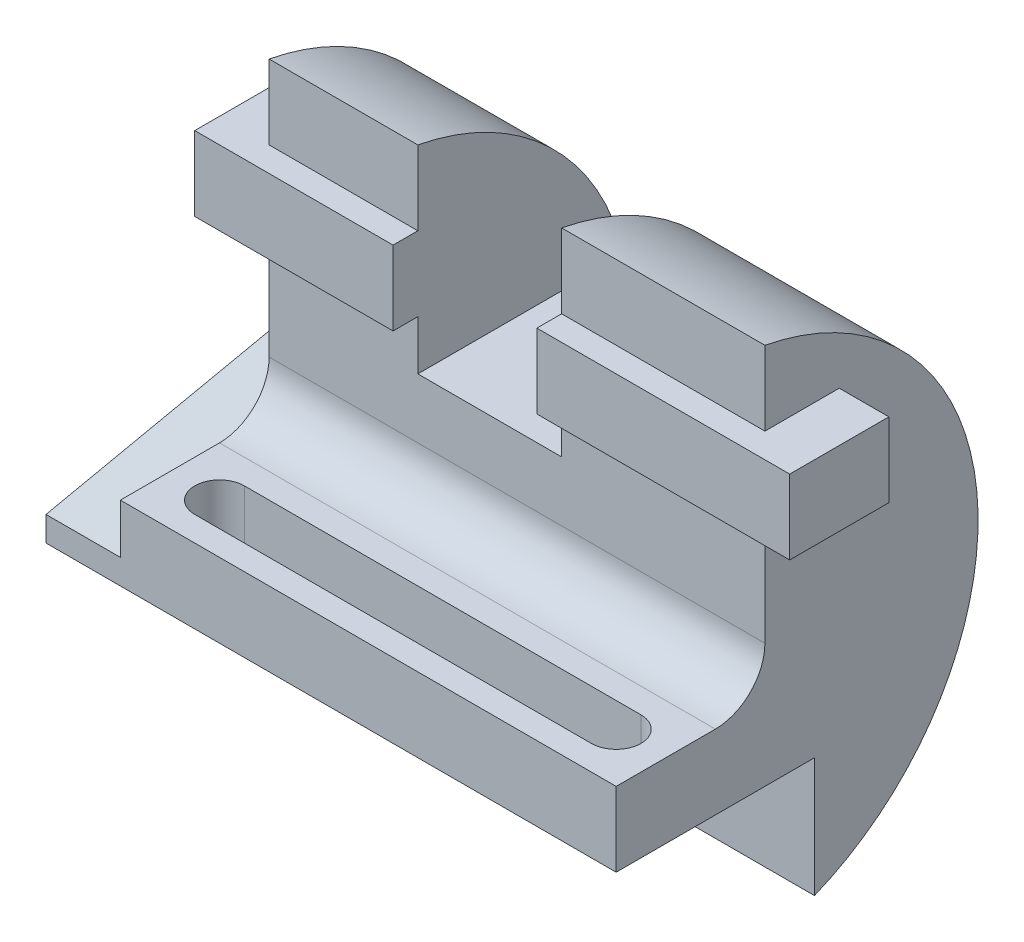
ISO-10303-21;
HEADER;
FILE_DESCRIPTION(('STEP AP214'),'2;1');
FILE_NAME('part.step','',(''),(''),'','','');
FILE_SCHEMA(('AUTOMOTIVE_DESIGN { 1 0 10303 214 1 1 1 1 }'));
ENDSEC;
DATA;
#1=APPLICATION_CONTEXT('core data for automotive mechanical design processes');
#2=APPLICATION_PROTOCOL_DEFINITION('international standard','automotive_design',2000,#1);
#3=PRODUCT_CONTEXT('',#1,'mechanical');
#4=PRODUCT('Part','Part','',(#3));
#5=PRODUCT_RELATED_PRODUCT_CATEGORY('part','',(#4));
#6=PRODUCT_DEFINITION_FORMATION('','',#4);
#7=PRODUCT_DEFINITION_CONTEXT('part definition',#1,'design');
#8=PRODUCT_DEFINITION('design','',#6,#7);
#9=PRODUCT_DEFINITION_SHAPE('','',#8);
#10=(LENGTH_UNIT() NAMED_UNIT(*) SI_UNIT(.MILLI.,.METRE.));
#11=(NAMED_UNIT(*) PLANE_ANGLE_UNIT() SI_UNIT($,.RADIAN.));
#12=(NAMED_UNIT(*) SI_UNIT($,.STERADIAN.) SOLID_ANGLE_UNIT());
#13=UNCERTAINTY_MEASURE_WITH_UNIT(LENGTH_MEASURE(1.E-05),#10,'distance_accuracy_value','');
#14=(GEOMETRIC_REPRESENTATION_CONTEXT(3) GLOBAL_UNCERTAINTY_ASSIGNED_CONTEXT((#13)) GLOBAL_UNIT_ASSIGNED_CONTEXT((#10,
#11,#12)) REPRESENTATION_CONTEXT('',''));
#15=CARTESIAN_POINT('',(0.,0.,0.));
#16=DIRECTION('',(0.,0.,1.));
#17=DIRECTION('',(1.,0.,0.));
#18=AXIS2_PLACEMENT_3D('',#15,#16,#17);
#19=CARTESIAN_POINT('',(-42.5,0.,-10.));
#20=DIRECTION('',(0.,0.,1.));
#21=DIRECTION('',(1.,0.,0.));
#22=AXIS2_PLACEMENT_3D('',#19,#20,#21);
#23=PLANE('',#22);
#24=DIRECTION('',(0.,-1.,0.));
#25=VECTOR('',#24,1.);
#26=CARTESIAN_POINT('',(-12.5,0.,-10.));
#27=LINE('',#26,#25);
#28=CARTESIAN_POINT('',(-12.5,52.0480547186924,-10.));
#29=VERTEX_POINT('',#28);
#30=CARTESIAN_POINT('',(-12.5,37.0480547186924,-10.));
#31=VERTEX_POINT('',#30);
#32=EDGE_CURVE('E537',#29,#31,#27,.T.);
#33=ORIENTED_EDGE('',*,*,#32,.F.);
#34=DIRECTION('',(1.,0.,0.));
#35=VECTOR('',#34,1.);
#36=CARTESIAN_POINT('',(-42.5,52.0480547186924,-10.));
#37=LINE('',#36,#35);
#38=CARTESIAN_POINT('',(-42.5,52.0480547186924,-10.));
#39=VERTEX_POINT('',#38);
#40=EDGE_CURVE('E251',#39,#29,#37,.T.);
#41=ORIENTED_EDGE('',*,*,#40,.F.);
#42=DIRECTION('',(0.,-1.,0.));
#43=VECTOR('',#42,1.);
#44=CARTESIAN_POINT('',(-42.5,0.,-10.));
#45=LINE('',#44,#43);
#46=CARTESIAN_POINT('',(-42.5,37.0480547186924,-10.));
#47=VERTEX_POINT('',#46);
#48=EDGE_CURVE('E274',#39,#47,#45,.T.);
#49=ORIENTED_EDGE('',*,*,#48,.T.);
#50=DIRECTION('',(-1.,0.,0.));
#51=VECTOR('',#50,1.);
#52=CARTESIAN_POINT('',(-42.5,37.0480547186924,-10.));
#53=LINE('',#52,#51);
#54=EDGE_CURVE('E334',#31,#47,#53,.T.);
#55=ORIENTED_EDGE('',*,*,#54,.F.);
#56=EDGE_LOOP('',(#33,#41,#49,#55));
#57=FACE_BOUND('',#56,.T.);
#58=ADVANCED_FACE('F39',(#57),#23,.T.);
#59=CARTESIAN_POINT('',(-52.5,37.0480547186924,-5.));
#60=DIRECTION('',(0.,1.,0.));
#61=DIRECTION('',(0.,0.,1.));
#62=AXIS2_PLACEMENT_3D('',#59,#60,#61);
#63=PLANE('',#62);
#64=DIRECTION('',(0.,0.,1.));
#65=VECTOR('',#64,1.);
#66=CARTESIAN_POINT('',(-12.5,37.0480547186924,-5.));
#67=LINE('',#66,#65);
#68=CARTESIAN_POINT('',(-12.5,37.0480547186924,-5.));
#69=VERTEX_POINT('',#68);
#70=EDGE_CURVE('E296',#31,#69,#67,.T.);
#71=ORIENTED_EDGE('',*,*,#70,.F.);
#72=ORIENTED_EDGE('',*,*,#54,.T.);
#73=DIRECTION('',(0.,0.,1.));
#74=VECTOR('',#73,1.);
#75=CARTESIAN_POINT('',(-42.5,37.0480547186924,0.));
#76=LINE('',#75,#74);
#77=CARTESIAN_POINT('',(-42.5,37.0480547186924,-25.));
#78=VERTEX_POINT('',#77);
#79=EDGE_CURVE('E338',#78,#47,#76,.T.);
#80=ORIENTED_EDGE('',*,*,#79,.F.);
#81=DIRECTION('',(1.,0.,0.));
#82=VECTOR('',#81,1.);
#83=CARTESIAN_POINT('',(-52.5,37.0480547186924,-25.));
#84=LINE('',#83,#82);
#85=CARTESIAN_POINT('',(-52.5,37.0480547186924,-25.));
#86=VERTEX_POINT('',#85);
#87=EDGE_CURVE('E421',#86,#78,#84,.T.);
#88=ORIENTED_EDGE('',*,*,#87,.F.);
#89=DIRECTION('',(0.,0.,1.));
#90=VECTOR('',#89,1.);
#91=CARTESIAN_POINT('',(-52.5,37.0480547186924,-5.));
#92=LINE('',#91,#90);
#93=CARTESIAN_POINT('',(-52.5,37.0480547186924,-5.));
#94=VERTEX_POINT('',#93);
#95=EDGE_CURVE('E322',#86,#94,#92,.T.);
#96=ORIENTED_EDGE('',*,*,#95,.T.);
#97=DIRECTION('',(1.,0.,0.));
#98=VECTOR('',#97,1.);
#99=CARTESIAN_POINT('',(-52.5,37.0480547186924,-5.));
#100=LINE('',#99,#98);
#101=EDGE_CURVE('E416',#94,#69,#100,.T.);
#102=ORIENTED_EDGE('',*,*,#101,.T.);
#103=EDGE_LOOP('',(#71,#72,#80,#88,#96,#102));
#104=FACE_BOUND('',#103,.T.);
#105=ADVANCED_FACE('F590',(#104),#63,.T.);
#106=CARTESIAN_POINT('',(-52.5,22.0480547186924,-5.));
#107=DIRECTION('',(0.,-1.,0.));
#108=DIRECTION('',(0.,0.,-1.));
#109=AXIS2_PLACEMENT_3D('',#106,#107,#108);
#110=PLANE('',#109);
#111=DIRECTION('',(0.,0.,-1.));
#112=VECTOR('',#111,1.);
#113=CARTESIAN_POINT('',(-12.5,22.0480547186924,-5.));
#114=LINE('',#113,#112);
#115=CARTESIAN_POINT('',(-12.5,22.0480547186924,-5.));
#116=VERTEX_POINT('',#115);
#117=CARTESIAN_POINT('',(-12.5,22.0480547186924,-10.));
#118=VERTEX_POINT('',#117);
#119=EDGE_CURVE('E244',#116,#118,#114,.T.);
#120=ORIENTED_EDGE('',*,*,#119,.F.);
#121=DIRECTION('',(1.,0.,0.));
#122=VECTOR('',#121,1.);
#123=CARTESIAN_POINT('',(-52.5,22.0480547186924,-5.));
#124=LINE('',#123,#122);
#125=CARTESIAN_POINT('',(-52.5,22.0480547186924,-5.));
#126=VERTEX_POINT('',#125);
#127=EDGE_CURVE('E304',#126,#116,#124,.T.);
#128=ORIENTED_EDGE('',*,*,#127,.F.);
#129=DIRECTION('',(0.,0.,-1.));
#130=VECTOR('',#129,1.);
#131=CARTESIAN_POINT('',(-52.5,22.0480547186924,-5.));
#132=LINE('',#131,#130);
#133=CARTESIAN_POINT('',(-52.5,22.0480547186924,-25.));
#134=VERTEX_POINT('',#133);
#135=EDGE_CURVE('E427',#126,#134,#132,.T.);
#136=ORIENTED_EDGE('',*,*,#135,.T.);
#137=DIRECTION('',(1.,0.,0.));
#138=VECTOR('',#137,1.);
#139=CARTESIAN_POINT('',(-52.5,22.0480547186924,-25.));
#140=LINE('',#139,#138);
#141=CARTESIAN_POINT('',(-42.5,22.0480547186924,-25.));
#142=VERTEX_POINT('',#141);
#143=EDGE_CURVE('E320',#134,#142,#140,.T.);
#144=ORIENTED_EDGE('',*,*,#143,.T.);
#145=DIRECTION('',(0.,0.,-1.));
#146=VECTOR('',#145,1.);
#147=CARTESIAN_POINT('',(-42.5,22.0480547186924,0.));
#148=LINE('',#147,#146);
#149=CARTESIAN_POINT('',(-42.5,22.0480547186924,-10.));
#150=VERTEX_POINT('',#149);
#151=EDGE_CURVE('E327',#150,#142,#148,.T.);
#152=ORIENTED_EDGE('',*,*,#151,.F.);
#153=DIRECTION('',(1.,0.,0.));
#154=VECTOR('',#153,1.);
#155=CARTESIAN_POINT('',(-42.5,22.0480547186924,-10.));
#156=LINE('',#155,#154);
#157=EDGE_CURVE('E307',#150,#118,#156,.T.);
#158=ORIENTED_EDGE('',*,*,#157,.T.);
#159=EDGE_LOOP('',(#120,#128,#136,#144,#152,#158));
#160=FACE_BOUND('',#159,.T.);
#161=ADVANCED_FACE('F302',(#160),#110,.T.);
#162=CARTESIAN_POINT('',(-52.5,37.0480547186924,-5.));
#163=DIRECTION('',(0.,0.,1.));
#164=DIRECTION('',(0.,-1.,0.));
#165=AXIS2_PLACEMENT_3D('',#162,#163,#164);
#166=PLANE('',#165);
#167=DIRECTION('',(0.,-1.,0.));
#168=VECTOR('',#167,1.);
#169=CARTESIAN_POINT('',(-12.5,37.0480547186924,-5.));
#170=LINE('',#169,#168);
#171=EDGE_CURVE('E48',#69,#116,#170,.T.);
#172=ORIENTED_EDGE('',*,*,#171,.F.);
#173=ORIENTED_EDGE('',*,*,#101,.F.);
#174=DIRECTION('',(0.,-1.,0.));
#175=VECTOR('',#174,1.);
#176=CARTESIAN_POINT('',(-52.5,37.0480547186924,-5.));
#177=LINE('',#176,#175);
#178=EDGE_CURVE('E313',#94,#126,#177,.T.);
#179=ORIENTED_EDGE('',*,*,#178,.T.);
#180=ORIENTED_EDGE('',*,*,#127,.T.);
#181=EDGE_LOOP('',(#172,#173,#179,#180));
#182=FACE_BOUND('',#181,.T.);
#183=ADVANCED_FACE('F311',(#182),#166,.T.);
#184=CARTESIAN_POINT('',(-42.5,0.,0.));
#185=DIRECTION('',(1.,0.,0.));
#186=DIRECTION('',(0.,0.,-1.));
#187=AXIS2_PLACEMENT_3D('',#184,#185,#186);
#188=PLANE('',#187);
#189=DIRECTION('',(0.,0.207911690817763,-0.978147600733805));
#190=VECTOR('',#189,1.);
#191=CARTESIAN_POINT('',(-42.5,-20.,20.));
#192=LINE('',#191,#190);
#193=CARTESIAN_POINT('',(-42.5,-20.,20.));
#194=VERTEX_POINT('',#193);
#195=CARTESIAN_POINT('',(-42.5,-4.52449566791573,-52.8065236400865));
#196=VERTEX_POINT('',#195);
#197=EDGE_CURVE('E472',#194,#196,#192,.T.);
#198=ORIENTED_EDGE('',*,*,#197,.F.);
#199=DIRECTION('',(0.,-1.,0.));
#200=VECTOR('',#199,1.);
#201=CARTESIAN_POINT('',(-42.5,-10.,20.));
#202=LINE('',#201,#200);
#203=CARTESIAN_POINT('',(-42.5,-10.,20.));
#204=VERTEX_POINT('',#203);
#205=EDGE_CURVE('E376',#204,#194,#202,.T.);
#206=ORIENTED_EDGE('',*,*,#205,.F.);
#207=DIRECTION('',(0.,0.,1.));
#208=VECTOR('',#207,1.);
#209=CARTESIAN_POINT('',(-42.5,-10.,0.));
#210=LINE('',#209,#208);
#211=CARTESIAN_POINT('',(-42.5,-10.,0.));
#212=VERTEX_POINT('',#211);
#213=EDGE_CURVE('E372',#212,#204,#210,.T.);
#214=ORIENTED_EDGE('',*,*,#213,.F.);
#215=CARTESIAN_POINT('',(-42.5,0.,0.));
#216=DIRECTION('',(-1.,0.,0.));
#217=DIRECTION('',(0.,0.,-1.));
#218=AXIS2_PLACEMENT_3D('',#215,#216,#217);
#219=CIRCLE('',#218,10.);
#220=CARTESIAN_POINT('',(-42.5,0.,-10.));
#221=VERTEX_POINT('',#220);
#222=EDGE_CURVE('E368',#221,#212,#219,.T.);
#223=ORIENTED_EDGE('',*,*,#222,.F.);
#224=EDGE_CURVE('E382',#150,#221,#45,.T.);
#225=ORIENTED_EDGE('',*,*,#224,.F.);
#226=ORIENTED_EDGE('',*,*,#151,.T.);
#227=DIRECTION('',(0.,1.,0.));
#228=VECTOR('',#227,1.);
#229=CARTESIAN_POINT('',(-42.5,0.,-25.));
#230=LINE('',#229,#228);
#231=EDGE_CURVE('E331',#142,#78,#230,.T.);
#232=ORIENTED_EDGE('',*,*,#231,.T.);
#233=ORIENTED_EDGE('',*,*,#79,.T.);
#234=ORIENTED_EDGE('',*,*,#48,.F.);
#235=CARTESIAN_POINT('',(-42.5,0.,0.));
#236=DIRECTION('',(1.,0.,0.));
#237=DIRECTION('',(0.,0.,1.));
#238=AXIS2_PLACEMENT_3D('',#235,#236,#237);
#239=CIRCLE('',#238,53.);
#240=EDGE_CURVE('E380',#196,#39,#239,.T.);
#241=ORIENTED_EDGE('',*,*,#240,.F.);
#242=EDGE_LOOP('',(#198,#206,#214,#223,#225,#226,#232,#233,#234,#241));
#243=FACE_BOUND('',#242,.T.);
#244=ADVANCED_FACE('F402',(#243),#188,.F.);
#245=DIRECTION('',(0.,1.,0.));
#246=VECTOR('',#245,1.);
#247=CARTESIAN_POINT('',(16.5,0.,-10.));
#248=LINE('',#247,#246);
#249=CARTESIAN_POINT('',(16.5,37.0480547186924,-10.));
#250=VERTEX_POINT('',#249);
#251=CARTESIAN_POINT('',(16.5,52.0480547186924,-10.));
#252=VERTEX_POINT('',#251);
#253=EDGE_CURVE('E222',#250,#252,#248,.T.);
#254=ORIENTED_EDGE('',*,*,#253,.F.);
#255=CARTESIAN_POINT('',(57.5,37.0480547186924,-10.));
#256=VERTEX_POINT('',#255);
#257=EDGE_CURVE('E335',#256,#250,#53,.T.);
#258=ORIENTED_EDGE('',*,*,#257,.F.);
#259=DIRECTION('',(0.,-1.,0.));
#260=VECTOR('',#259,1.);
#261=CARTESIAN_POINT('',(57.5,0.,-10.));
#262=LINE('',#261,#260);
#263=CARTESIAN_POINT('',(57.5,52.0480547186924,-10.));
#264=VERTEX_POINT('',#263);
#265=EDGE_CURVE('E249',#264,#256,#262,.T.);
#266=ORIENTED_EDGE('',*,*,#265,.F.);
#267=EDGE_CURVE('E241',#252,#264,#37,.T.);
#268=ORIENTED_EDGE('',*,*,#267,.F.);
#269=EDGE_LOOP('',(#254,#258,#266,#268));
#270=FACE_BOUND('',#269,.T.);
#271=ADVANCED_FACE('F247',(#270),#23,.T.);
#272=CARTESIAN_POINT('',(-42.5,0.,0.));
#273=DIRECTION('',(1.,0.,0.));
#274=DIRECTION('',(0.,0.,-1.));
#275=AXIS2_PLACEMENT_3D('',#272,#273,#274);
#276=CYLINDRICAL_SURFACE('',#275,10.);
#277=DIRECTION('',(1.,0.,0.));
#278=VECTOR('',#277,1.);
#279=CARTESIAN_POINT('',(-42.5,-10.,0.));
#280=LINE('',#279,#278);
#281=CARTESIAN_POINT('',(57.5,-10.,0.));
#282=VERTEX_POINT('',#281);
#283=EDGE_CURVE('E271',#212,#282,#280,.T.);
#284=ORIENTED_EDGE('',*,*,#283,.T.);
#285=CARTESIAN_POINT('',(57.5,0.,0.));
#286=DIRECTION('',(-1.,0.,0.));
#287=DIRECTION('',(0.,0.,-1.));
#288=AXIS2_PLACEMENT_3D('',#285,#286,#287);
#289=CIRCLE('',#288,10.);
#290=CARTESIAN_POINT('',(57.5,0.,-10.));
#291=VERTEX_POINT('',#290);
#292=EDGE_CURVE('E342',#291,#282,#289,.T.);
#293=ORIENTED_EDGE('',*,*,#292,.F.);
#294=DIRECTION('',(1.,0.,0.));
#295=VECTOR('',#294,1.);
#296=CARTESIAN_POINT('',(-42.5,0.,-10.));
#297=LINE('',#296,#295);
#298=EDGE_CURVE('E257',#221,#291,#297,.T.);
#299=ORIENTED_EDGE('',*,*,#298,.F.);
#300=ORIENTED_EDGE('',*,*,#222,.T.);
#301=EDGE_LOOP('',(#284,#293,#299,#300));
#302=FACE_BOUND('',#301,.T.);
#303=ADVANCED_FACE('F41',(#302),#276,.F.);
#304=DIRECTION('',(0.,-1.,0.));
#305=VECTOR('',#304,1.);
#306=CARTESIAN_POINT('',(-12.5,0.,-10.));
#307=LINE('',#306,#305);
#308=CARTESIAN_POINT('',(-12.5,12.0480547186924,-10.));
#309=VERTEX_POINT('',#308);
#310=EDGE_CURVE('E540',#118,#309,#307,.T.);
#311=ORIENTED_EDGE('',*,*,#310,.F.);
#312=ORIENTED_EDGE('',*,*,#157,.F.);
#313=ORIENTED_EDGE('',*,*,#224,.T.);
#314=ORIENTED_EDGE('',*,*,#298,.T.);
#315=CARTESIAN_POINT('',(57.5,22.0480547186924,-10.));
#316=VERTEX_POINT('',#315);
#317=EDGE_CURVE('E365',#316,#291,#262,.T.);
#318=ORIENTED_EDGE('',*,*,#317,.F.);
#319=CARTESIAN_POINT('',(16.5,22.0480547186924,-10.));
#320=VERTEX_POINT('',#319);
#321=EDGE_CURVE('E328',#320,#316,#156,.T.);
#322=ORIENTED_EDGE('',*,*,#321,.F.);
#323=DIRECTION('',(0.,1.,0.));
#324=VECTOR('',#323,1.);
#325=CARTESIAN_POINT('',(16.5,0.,-10.));
#326=LINE('',#325,#324);
#327=CARTESIAN_POINT('',(16.5,12.0480547186924,-10.));
#328=VERTEX_POINT('',#327);
#329=EDGE_CURVE('E234',#328,#320,#326,.T.);
#330=ORIENTED_EDGE('',*,*,#329,.F.);
#331=DIRECTION('',(1.,0.,0.));
#332=VECTOR('',#331,1.);
#333=CARTESIAN_POINT('',(-42.5,12.0480547186924,-10.));
#334=LINE('',#333,#332);
#335=EDGE_CURVE('E531',#309,#328,#334,.T.);
#336=ORIENTED_EDGE('',*,*,#335,.F.);
#337=EDGE_LOOP('',(#311,#312,#313,#314,#318,#322,#330,#336));
#338=FACE_BOUND('',#337,.T.);
#339=ADVANCED_FACE('F394',(#338),#23,.T.);
#340=CARTESIAN_POINT('',(-42.5,0.,0.));
#341=DIRECTION('',(1.,0.,0.));
#342=DIRECTION('',(0.,0.,-1.));
#343=AXIS2_PLACEMENT_3D('',#340,#341,#342);
#344=CYLINDRICAL_SURFACE('',#343,53.);
#345=CARTESIAN_POINT('',(-12.5,0.,0.));
#346=DIRECTION('',(-1.,0.,0.));
#347=DIRECTION('',(0.,-1.,0.));
#348=AXIS2_PLACEMENT_3D('',#345,#346,#347);
#349=CIRCLE('',#348,53.);
#350=CARTESIAN_POINT('',(-12.5,12.0480547186924,-51.612444017847));
#351=VERTEX_POINT('',#350);
#352=EDGE_CURVE('E534',#351,#29,#349,.F.);
#353=ORIENTED_EDGE('',*,*,#352,.F.);
#354=DIRECTION('',(1.,0.,0.));
#355=VECTOR('',#354,1.);
#356=CARTESIAN_POINT('',(-42.5,12.0480547186924,-51.612444017847));
#357=LINE('',#356,#355);
#358=CARTESIAN_POINT('',(16.5,12.0480547186924,-51.612444017847));
#359=VERTEX_POINT('',#358);
#360=EDGE_CURVE('E11',#359,#351,#357,.F.);
#361=ORIENTED_EDGE('',*,*,#360,.F.);
#362=CARTESIAN_POINT('',(16.5,0.,0.));
#363=DIRECTION('',(1.,0.,0.));
#364=DIRECTION('',(0.,1.,0.));
#365=AXIS2_PLACEMENT_3D('',#362,#363,#364);
#366=CIRCLE('',#365,53.);
#367=EDGE_CURVE('E226',#252,#359,#366,.F.);
#368=ORIENTED_EDGE('',*,*,#367,.F.);
#369=ORIENTED_EDGE('',*,*,#267,.T.);
#370=CARTESIAN_POINT('',(57.5,0.,0.));
#371=DIRECTION('',(1.,0.,0.));
#372=DIRECTION('',(0.,0.,1.));
#373=AXIS2_PLACEMENT_3D('',#370,#371,#372);
#374=CIRCLE('',#373,53.);
#375=CARTESIAN_POINT('',(57.5,-49.0815647672321,-20.));
#376=VERTEX_POINT('',#375);
#377=EDGE_CURVE('E362',#376,#264,#374,.T.);
#378=ORIENTED_EDGE('',*,*,#377,.F.);
#379=DIRECTION('',(1.,0.,0.));
#380=VECTOR('',#379,1.);
#381=CARTESIAN_POINT('',(-42.5,-49.0815647672321,-20.));
#382=LINE('',#381,#380);
#383=CARTESIAN_POINT('',(-57.5,-49.0815647672321,-20.));
#384=VERTEX_POINT('',#383);
#385=EDGE_CURVE('E252',#384,#376,#382,.T.);
#386=ORIENTED_EDGE('',*,*,#385,.F.);
#387=CARTESIAN_POINT('',(-57.5,0.,0.));
#388=DIRECTION('',(-1.,0.,0.));
#389=DIRECTION('',(0.,0.,1.));
#390=AXIS2_PLACEMENT_3D('',#387,#388,#389);
#391=CIRCLE('',#390,53.);
#392=CARTESIAN_POINT('',(-57.5,-4.52449566791573,-52.8065236400865));
#393=VERTEX_POINT('',#392);
#394=EDGE_CURVE('E476',#393,#384,#391,.T.);
#395=ORIENTED_EDGE('',*,*,#394,.F.);
#396=DIRECTION('',(1.,0.,0.));
#397=VECTOR('',#396,1.);
#398=CARTESIAN_POINT('',(-57.5,-4.52449566791573,-52.8065236400865));
#399=LINE('',#398,#397);
#400=EDGE_CURVE('E467',#393,#196,#399,.T.);
#401=ORIENTED_EDGE('',*,*,#400,.T.);
#402=ORIENTED_EDGE('',*,*,#240,.T.);
#403=ORIENTED_EDGE('',*,*,#40,.T.);
#404=EDGE_LOOP('',(#353,#361,#368,#369,#378,#386,#395,#401,#402,#403));
#405=FACE_BOUND('',#404,.T.);
#406=ADVANCED_FACE('F239',(#405),#344,.T.);
#407=CARTESIAN_POINT('',(-42.5,-25.,-20.));
#408=DIRECTION('',(0.,0.,1.));
#409=DIRECTION('',(1.,0.,0.));
#410=AXIS2_PLACEMENT_3D('',#407,#408,#409);
#411=PLANE('',#410);
#412=ORIENTED_EDGE('',*,*,#385,.T.);
#413=DIRECTION('',(0.,-1.,0.));
#414=VECTOR('',#413,1.);
#415=CARTESIAN_POINT('',(57.5,-25.,-20.));
#416=LINE('',#415,#414);
#417=CARTESIAN_POINT('',(57.5,-25.,-20.));
#418=VERTEX_POINT('',#417);
#419=EDGE_CURVE('E358',#418,#376,#416,.T.);
#420=ORIENTED_EDGE('',*,*,#419,.F.);
#421=DIRECTION('',(1.,0.,0.));
#422=VECTOR('',#421,1.);
#423=CARTESIAN_POINT('',(-42.5,-25.,-20.));
#424=LINE('',#423,#422);
#425=CARTESIAN_POINT('',(-57.5,-25.,-20.));
#426=VERTEX_POINT('',#425);
#427=EDGE_CURVE('E258',#426,#418,#424,.T.);
#428=ORIENTED_EDGE('',*,*,#427,.F.);
#429=DIRECTION('',(0.,1.,0.));
#430=VECTOR('',#429,1.);
#431=CARTESIAN_POINT('',(-57.5,-25.,-20.));
#432=LINE('',#431,#430);
#433=EDGE_CURVE('E487',#384,#426,#432,.T.);
#434=ORIENTED_EDGE('',*,*,#433,.F.);
#435=EDGE_LOOP('',(#412,#420,#428,#434));
#436=FACE_BOUND('',#435,.T.);
#437=ADVANCED_FACE('F577',(#436),#411,.T.);
#438=CARTESIAN_POINT('',(-42.5,-25.,20.));
#439=DIRECTION('',(0.,-1.,0.));
#440=DIRECTION('',(0.,0.,-1.));
#441=AXIS2_PLACEMENT_3D('',#438,#439,#440);
#442=PLANE('',#441);
#443=CARTESIAN_POINT('',(-32.5,-25.,10.));
#444=DIRECTION('',(0.,-1.,0.));
#445=DIRECTION('',(0.,0.,-1.));
#446=AXIS2_PLACEMENT_3D('',#443,#444,#445);
#447=CIRCLE('',#446,5.);
#448=CARTESIAN_POINT('',(-32.5,-25.,15.));
#449=VERTEX_POINT('',#448);
#450=CARTESIAN_POINT('',(-32.5,-25.,5.));
#451=VERTEX_POINT('',#450);
#452=EDGE_CURVE('E477',#449,#451,#447,.T.);
#453=ORIENTED_EDGE('',*,*,#452,.F.);
#454=DIRECTION('',(-1.,0.,0.));
#455=VECTOR('',#454,1.);
#456=CARTESIAN_POINT('',(-42.5,-25.,15.));
#457=LINE('',#456,#455);
#458=CARTESIAN_POINT('',(47.5,-25.,15.));
#459=VERTEX_POINT('',#458);
#460=EDGE_CURVE('E502',#459,#449,#457,.T.);
#461=ORIENTED_EDGE('',*,*,#460,.F.);
#462=CARTESIAN_POINT('',(47.5,-25.,10.));
#463=DIRECTION('',(0.,-1.,0.));
#464=DIRECTION('',(0.,0.,-1.));
#465=AXIS2_PLACEMENT_3D('',#462,#463,#464);
#466=CIRCLE('',#465,5.);
#467=CARTESIAN_POINT('',(47.5,-25.,5.));
#468=VERTEX_POINT('',#467);
#469=EDGE_CURVE('E499',#468,#459,#466,.T.);
#470=ORIENTED_EDGE('',*,*,#469,.F.);
#471=DIRECTION('',(1.,0.,0.));
#472=VECTOR('',#471,1.);
#473=CARTESIAN_POINT('',(-42.5,-25.,5.));
#474=LINE('',#473,#472);
#475=EDGE_CURVE('E496',#451,#468,#474,.T.);
#476=ORIENTED_EDGE('',*,*,#475,.F.);
#477=EDGE_LOOP('',(#453,#461,#470,#476));
#478=FACE_BOUND('',#477,.T.);
#479=ORIENTED_EDGE('',*,*,#427,.T.);
#480=DIRECTION('',(0.,0.,-1.));
#481=VECTOR('',#480,1.);
#482=CARTESIAN_POINT('',(57.5,-25.,20.));
#483=LINE('',#482,#481);
#484=CARTESIAN_POINT('',(57.5,-25.,20.));
#485=VERTEX_POINT('',#484);
#486=EDGE_CURVE('E354',#485,#418,#483,.T.);
#487=ORIENTED_EDGE('',*,*,#486,.F.);
#488=DIRECTION('',(1.,0.,0.));
#489=VECTOR('',#488,1.);
#490=CARTESIAN_POINT('',(-42.5,-25.,20.));
#491=LINE('',#490,#489);
#492=CARTESIAN_POINT('',(-57.5,-25.,20.));
#493=VERTEX_POINT('',#492);
#494=EDGE_CURVE('E265',#493,#485,#491,.T.);
#495=ORIENTED_EDGE('',*,*,#494,.F.);
#496=DIRECTION('',(0.,0.,1.));
#497=VECTOR('',#496,1.);
#498=CARTESIAN_POINT('',(-57.5,-25.,20.));
#499=LINE('',#498,#497);
#500=EDGE_CURVE('E483',#426,#493,#499,.T.);
#501=ORIENTED_EDGE('',*,*,#500,.F.);
#502=EDGE_LOOP('',(#479,#487,#495,#501));
#503=FACE_BOUND('',#502,.T.);
#504=ADVANCED_FACE('F622',(#478,#503),#442,.T.);
#505=CARTESIAN_POINT('',(-42.5,-10.,20.));
#506=DIRECTION('',(0.,0.,1.));
#507=DIRECTION('',(0.,-1.,0.));
#508=AXIS2_PLACEMENT_3D('',#505,#506,#507);
#509=PLANE('',#508);
#510=ORIENTED_EDGE('',*,*,#494,.T.);
#511=DIRECTION('',(0.,-1.,0.));
#512=VECTOR('',#511,1.);
#513=CARTESIAN_POINT('',(57.5,-10.,20.));
#514=LINE('',#513,#512);
#515=CARTESIAN_POINT('',(57.5,-10.,20.));
#516=VERTEX_POINT('',#515);
#517=EDGE_CURVE('E350',#516,#485,#514,.T.);
#518=ORIENTED_EDGE('',*,*,#517,.F.);
#519=DIRECTION('',(1.,0.,0.));
#520=VECTOR('',#519,1.);
#521=CARTESIAN_POINT('',(-42.5,-10.,20.));
#522=LINE('',#521,#520);
#523=EDGE_CURVE('E268',#204,#516,#522,.T.);
#524=ORIENTED_EDGE('',*,*,#523,.F.);
#525=ORIENTED_EDGE('',*,*,#205,.T.);
#526=DIRECTION('',(1.,0.,0.));
#527=VECTOR('',#526,1.);
#528=CARTESIAN_POINT('',(-57.5,-20.,20.));
#529=LINE('',#528,#527);
#530=CARTESIAN_POINT('',(-57.5,-20.,20.));
#531=VERTEX_POINT('',#530);
#532=EDGE_CURVE('E463',#531,#194,#529,.T.);
#533=ORIENTED_EDGE('',*,*,#532,.F.);
#534=DIRECTION('',(0.,1.,0.));
#535=VECTOR('',#534,1.);
#536=CARTESIAN_POINT('',(-57.5,-25.,20.));
#537=LINE('',#536,#535);
#538=EDGE_CURVE('E480',#493,#531,#537,.T.);
#539=ORIENTED_EDGE('',*,*,#538,.F.);
#540=EDGE_LOOP('',(#510,#518,#524,#525,#533,#539));
#541=FACE_BOUND('',#540,.T.);
#542=ADVANCED_FACE('F611',(#541),#509,.T.);
#543=CARTESIAN_POINT('',(-42.5,-10.,0.));
#544=DIRECTION('',(0.,1.,0.));
#545=DIRECTION('',(0.,0.,1.));
#546=AXIS2_PLACEMENT_3D('',#543,#544,#545);
#547=PLANE('',#546);
#548=CARTESIAN_POINT('',(-32.5,-10.,10.));
#549=DIRECTION('',(0.,1.,0.));
#550=DIRECTION('',(0.,0.,1.));
#551=AXIS2_PLACEMENT_3D('',#548,#549,#550);
#552=CIRCLE('',#551,5.);
#553=CARTESIAN_POINT('',(-32.5,-10.,5.));
#554=VERTEX_POINT('',#553);
#555=CARTESIAN_POINT('',(-32.5,-10.,15.));
#556=VERTEX_POINT('',#555);
#557=EDGE_CURVE('E528',#554,#556,#552,.T.);
#558=ORIENTED_EDGE('',*,*,#557,.F.);
#559=DIRECTION('',(-1.,0.,0.));
#560=VECTOR('',#559,1.);
#561=CARTESIAN_POINT('',(-32.5,-10.,5.));
#562=LINE('',#561,#560);
#563=CARTESIAN_POINT('',(47.5,-10.,5.));
#564=VERTEX_POINT('',#563);
#565=EDGE_CURVE('E510',#564,#554,#562,.T.);
#566=ORIENTED_EDGE('',*,*,#565,.F.);
#567=CARTESIAN_POINT('',(47.5,-10.,10.));
#568=DIRECTION('',(0.,1.,0.));
#569=DIRECTION('',(0.,0.,-1.));
#570=AXIS2_PLACEMENT_3D('',#567,#568,#569);
#571=CIRCLE('',#570,5.);
#572=CARTESIAN_POINT('',(47.5,-10.,15.));
#573=VERTEX_POINT('',#572);
#574=EDGE_CURVE('E521',#573,#564,#571,.T.);
#575=ORIENTED_EDGE('',*,*,#574,.F.);
#576=DIRECTION('',(1.,0.,0.));
#577=VECTOR('',#576,1.);
#578=CARTESIAN_POINT('',(-32.5,-10.,15.));
#579=LINE('',#578,#577);
#580=EDGE_CURVE('E525',#556,#573,#579,.T.);
#581=ORIENTED_EDGE('',*,*,#580,.F.);
#582=EDGE_LOOP('',(#558,#566,#575,#581));
#583=FACE_BOUND('',#582,.T.);
#584=ORIENTED_EDGE('',*,*,#523,.T.);
#585=DIRECTION('',(0.,0.,1.));
#586=VECTOR('',#585,1.);
#587=CARTESIAN_POINT('',(57.5,-10.,0.));
#588=LINE('',#587,#586);
#589=EDGE_CURVE('E346',#282,#516,#588,.T.);
#590=ORIENTED_EDGE('',*,*,#589,.F.);
#591=ORIENTED_EDGE('',*,*,#283,.F.);
#592=ORIENTED_EDGE('',*,*,#213,.T.);
#593=EDGE_LOOP('',(#584,#590,#591,#592));
#594=FACE_BOUND('',#593,.T.);
#595=ADVANCED_FACE('F405',(#583,#594),#547,.T.);
#596=CARTESIAN_POINT('',(57.5,0.,0.));
#597=DIRECTION('',(1.,0.,0.));
#598=DIRECTION('',(0.,0.,-1.));
#599=AXIS2_PLACEMENT_3D('',#596,#597,#598);
#600=PLANE('',#599);
#601=DIRECTION('',(0.,0.,1.));
#602=VECTOR('',#601,1.);
#603=CARTESIAN_POINT('',(57.5,37.0480547186924,0.));
#604=LINE('',#603,#602);
#605=CARTESIAN_POINT('',(57.5,37.0480547186924,-25.));
#606=VERTEX_POINT('',#605);
#607=EDGE_CURVE('E283',#606,#256,#604,.T.);
#608=ORIENTED_EDGE('',*,*,#607,.F.);
#609=DIRECTION('',(0.,1.,0.));
#610=VECTOR('',#609,1.);
#611=CARTESIAN_POINT('',(57.5,0.,-25.));
#612=LINE('',#611,#610);
#613=CARTESIAN_POINT('',(57.5,22.0480547186924,-25.));
#614=VERTEX_POINT('',#613);
#615=EDGE_CURVE('E279',#614,#606,#612,.T.);
#616=ORIENTED_EDGE('',*,*,#615,.F.);
#617=DIRECTION('',(0.,0.,-1.));
#618=VECTOR('',#617,1.);
#619=CARTESIAN_POINT('',(57.5,22.0480547186924,0.));
#620=LINE('',#619,#618);
#621=EDGE_CURVE('E275',#316,#614,#620,.T.);
#622=ORIENTED_EDGE('',*,*,#621,.F.);
#623=ORIENTED_EDGE('',*,*,#317,.T.);
#624=ORIENTED_EDGE('',*,*,#292,.T.);
#625=ORIENTED_EDGE('',*,*,#589,.T.);
#626=ORIENTED_EDGE('',*,*,#517,.T.);
#627=ORIENTED_EDGE('',*,*,#486,.T.);
#628=ORIENTED_EDGE('',*,*,#419,.T.);
#629=ORIENTED_EDGE('',*,*,#377,.T.);
#630=ORIENTED_EDGE('',*,*,#265,.T.);
#631=EDGE_LOOP('',(#608,#616,#622,#623,#624,#625,#626,#627,#628,#629,#630));
#632=FACE_BOUND('',#631,.T.);
#633=ADVANCED_FACE('F409',(#632),#600,.T.);
#634=DIRECTION('',(0.,0.,-1.));
#635=VECTOR('',#634,1.);
#636=CARTESIAN_POINT('',(16.5,37.0480547186924,-5.));
#637=LINE('',#636,#635);
#638=CARTESIAN_POINT('',(16.5,37.0480547186924,-5.));
#639=VERTEX_POINT('',#638);
#640=EDGE_CURVE('E229',#639,#250,#637,.T.);
#641=ORIENTED_EDGE('',*,*,#640,.F.);
#642=CARTESIAN_POINT('',(67.5,37.0480547186924,-5.));
#643=VERTEX_POINT('',#642);
#644=EDGE_CURVE('E418',#639,#643,#100,.T.);
#645=ORIENTED_EDGE('',*,*,#644,.T.);
#646=DIRECTION('',(0.,0.,1.));
#647=VECTOR('',#646,1.);
#648=CARTESIAN_POINT('',(67.5,37.0480547186924,-5.));
#649=LINE('',#648,#647);
#650=CARTESIAN_POINT('',(67.5,37.0480547186924,-25.));
#651=VERTEX_POINT('',#650);
#652=EDGE_CURVE('E447',#651,#643,#649,.T.);
#653=ORIENTED_EDGE('',*,*,#652,.F.);
#654=EDGE_CURVE('E424',#606,#651,#84,.T.);
#655=ORIENTED_EDGE('',*,*,#654,.F.);
#656=ORIENTED_EDGE('',*,*,#607,.T.);
#657=ORIENTED_EDGE('',*,*,#257,.T.);
#658=EDGE_LOOP('',(#641,#645,#653,#655,#656,#657));
#659=FACE_BOUND('',#658,.T.);
#660=ADVANCED_FACE('F570',(#659),#63,.T.);
#661=CARTESIAN_POINT('',(-52.5,37.0480547186924,-25.));
#662=DIRECTION('',(0.,0.,-1.));
#663=DIRECTION('',(0.,1.,0.));
#664=AXIS2_PLACEMENT_3D('',#661,#662,#663);
#665=PLANE('',#664);
#666=ORIENTED_EDGE('',*,*,#231,.F.);
#667=ORIENTED_EDGE('',*,*,#143,.F.);
#668=DIRECTION('',(0.,1.,0.));
#669=VECTOR('',#668,1.);
#670=CARTESIAN_POINT('',(-52.5,37.0480547186924,-25.));
#671=LINE('',#670,#669);
#672=EDGE_CURVE('E433',#134,#86,#671,.T.);
#673=ORIENTED_EDGE('',*,*,#672,.T.);
#674=ORIENTED_EDGE('',*,*,#87,.T.);
#675=EDGE_LOOP('',(#666,#667,#673,#674));
#676=FACE_BOUND('',#675,.T.);
#677=ADVANCED_FACE('F432',(#676),#665,.T.);
#678=DIRECTION('',(0.,0.,1.));
#679=VECTOR('',#678,1.);
#680=CARTESIAN_POINT('',(16.5,22.0480547186924,-5.));
#681=LINE('',#680,#679);
#682=CARTESIAN_POINT('',(16.5,22.0480547186924,-5.));
#683=VERTEX_POINT('',#682);
#684=EDGE_CURVE('E55',#320,#683,#681,.T.);
#685=ORIENTED_EDGE('',*,*,#684,.F.);
#686=ORIENTED_EDGE('',*,*,#321,.T.);
#687=ORIENTED_EDGE('',*,*,#621,.T.);
#688=CARTESIAN_POINT('',(67.5,22.0480547186924,-25.));
#689=VERTEX_POINT('',#688);
#690=EDGE_CURVE('E315',#614,#689,#140,.T.);
#691=ORIENTED_EDGE('',*,*,#690,.T.);
#692=DIRECTION('',(0.,0.,-1.));
#693=VECTOR('',#692,1.);
#694=CARTESIAN_POINT('',(67.5,22.0480547186924,-5.));
#695=LINE('',#694,#693);
#696=CARTESIAN_POINT('',(67.5,22.0480547186924,-5.));
#697=VERTEX_POINT('',#696);
#698=EDGE_CURVE('E455',#697,#689,#695,.T.);
#699=ORIENTED_EDGE('',*,*,#698,.F.);
#700=EDGE_CURVE('E316',#683,#697,#124,.T.);
#701=ORIENTED_EDGE('',*,*,#700,.F.);
#702=EDGE_LOOP('',(#685,#686,#687,#691,#699,#701));
#703=FACE_BOUND('',#702,.T.);
#704=ADVANCED_FACE('F561',(#703),#110,.T.);
#705=DIRECTION('',(0.,1.,0.));
#706=VECTOR('',#705,1.);
#707=CARTESIAN_POINT('',(16.5,37.0480547186924,-5.));
#708=LINE('',#707,#706);
#709=EDGE_CURVE('E287',#683,#639,#708,.T.);
#710=ORIENTED_EDGE('',*,*,#709,.F.);
#711=ORIENTED_EDGE('',*,*,#700,.T.);
#712=DIRECTION('',(0.,-1.,0.));
#713=VECTOR('',#712,1.);
#714=CARTESIAN_POINT('',(67.5,37.0480547186924,-5.));
#715=LINE('',#714,#713);
#716=EDGE_CURVE('E459',#643,#697,#715,.T.);
#717=ORIENTED_EDGE('',*,*,#716,.F.);
#718=ORIENTED_EDGE('',*,*,#644,.F.);
#719=EDGE_LOOP('',(#710,#711,#717,#718));
#720=FACE_BOUND('',#719,.T.);
#721=ADVANCED_FACE('F567',(#720),#166,.T.);
#722=ORIENTED_EDGE('',*,*,#690,.F.);
#723=ORIENTED_EDGE('',*,*,#615,.T.);
#724=ORIENTED_EDGE('',*,*,#654,.T.);
#725=DIRECTION('',(0.,1.,0.));
#726=VECTOR('',#725,1.);
#727=CARTESIAN_POINT('',(67.5,37.0480547186924,-25.));
#728=LINE('',#727,#726);
#729=EDGE_CURVE('E451',#689,#651,#728,.T.);
#730=ORIENTED_EDGE('',*,*,#729,.F.);
#731=EDGE_LOOP('',(#722,#723,#724,#730));
#732=FACE_BOUND('',#731,.T.);
#733=ADVANCED_FACE('F606',(#732),#665,.T.);
#734=CARTESIAN_POINT('',(-52.5,0.,0.));
#735=DIRECTION('',(1.,0.,0.));
#736=DIRECTION('',(0.,0.,-1.));
#737=AXIS2_PLACEMENT_3D('',#734,#735,#736);
#738=PLANE('',#737);
#739=ORIENTED_EDGE('',*,*,#178,.F.);
#740=ORIENTED_EDGE('',*,*,#95,.F.);
#741=ORIENTED_EDGE('',*,*,#672,.F.);
#742=ORIENTED_EDGE('',*,*,#135,.F.);
#743=EDGE_LOOP('',(#739,#740,#741,#742));
#744=FACE_BOUND('',#743,.T.);
#745=ADVANCED_FACE('F436',(#744),#738,.F.);
#746=CARTESIAN_POINT('',(67.5,0.,0.));
#747=DIRECTION('',(1.,0.,0.));
#748=DIRECTION('',(0.,0.,-1.));
#749=AXIS2_PLACEMENT_3D('',#746,#747,#748);
#750=PLANE('',#749);
#751=ORIENTED_EDGE('',*,*,#716,.T.);
#752=ORIENTED_EDGE('',*,*,#698,.T.);
#753=ORIENTED_EDGE('',*,*,#729,.T.);
#754=ORIENTED_EDGE('',*,*,#652,.T.);
#755=EDGE_LOOP('',(#751,#752,#753,#754));
#756=FACE_BOUND('',#755,.T.);
#757=ADVANCED_FACE('F787',(#756),#750,.T.);
#758=CARTESIAN_POINT('',(-57.5,-20.,20.));
#759=DIRECTION('',(0.,-0.978147600733805,-0.207911690817763));
#760=DIRECTION('',(0.,0.207911690817763,-0.978147600733805));
#761=AXIS2_PLACEMENT_3D('',#758,#759,#760);
#762=PLANE('',#761);
#763=ORIENTED_EDGE('',*,*,#197,.T.);
#764=ORIENTED_EDGE('',*,*,#400,.F.);
#765=DIRECTION('',(0.,0.207911690817763,-0.978147600733805));
#766=VECTOR('',#765,1.);
#767=CARTESIAN_POINT('',(-57.5,-20.,20.));
#768=LINE('',#767,#766);
#769=EDGE_CURVE('E471',#531,#393,#768,.T.);
#770=ORIENTED_EDGE('',*,*,#769,.F.);
#771=ORIENTED_EDGE('',*,*,#532,.T.);
#772=EDGE_LOOP('',(#763,#764,#770,#771));
#773=FACE_BOUND('',#772,.T.);
#774=ADVANCED_FACE('F586',(#773),#762,.F.);
#775=CARTESIAN_POINT('',(-57.5,0.,0.));
#776=DIRECTION('',(-1.,0.,0.));
#777=DIRECTION('',(0.,0.,1.));
#778=AXIS2_PLACEMENT_3D('',#775,#776,#777);
#779=PLANE('',#778);
#780=ORIENTED_EDGE('',*,*,#394,.T.);
#781=ORIENTED_EDGE('',*,*,#433,.T.);
#782=ORIENTED_EDGE('',*,*,#500,.T.);
#783=ORIENTED_EDGE('',*,*,#538,.T.);
#784=ORIENTED_EDGE('',*,*,#769,.T.);
#785=EDGE_LOOP('',(#780,#781,#782,#783,#784));
#786=FACE_BOUND('',#785,.T.);
#787=ADVANCED_FACE('F580',(#786),#779,.T.);
#788=CARTESIAN_POINT('',(-32.5,-49.0815647672321,10.));
#789=DIRECTION('',(0.,1.,0.));
#790=DIRECTION('',(0.,0.,1.));
#791=AXIS2_PLACEMENT_3D('',#788,#789,#790);
#792=CYLINDRICAL_SURFACE('',#791,5.);
#793=ORIENTED_EDGE('',*,*,#452,.T.);
#794=DIRECTION('',(0.,1.,0.));
#795=VECTOR('',#794,1.);
#796=CARTESIAN_POINT('',(-32.5,-49.0815647672321,4.99999999999999));
#797=LINE('',#796,#795);
#798=EDGE_CURVE('E505',#451,#554,#797,.T.);
#799=ORIENTED_EDGE('',*,*,#798,.T.);
#800=ORIENTED_EDGE('',*,*,#557,.T.);
#801=DIRECTION('',(0.,1.,0.));
#802=VECTOR('',#801,1.);
#803=CARTESIAN_POINT('',(-32.5,-49.0815647672321,15.));
#804=LINE('',#803,#802);
#805=EDGE_CURVE('E506',#449,#556,#804,.T.);
#806=ORIENTED_EDGE('',*,*,#805,.F.);
#807=EDGE_LOOP('',(#793,#799,#800,#806));
#808=FACE_BOUND('',#807,.T.);
#809=ADVANCED_FACE('F650',(#808),#792,.F.);
#810=CARTESIAN_POINT('',(-32.5,-49.0815647672321,4.99999999999999));
#811=DIRECTION('',(0.,0.,-1.));
#812=DIRECTION('',(0.,1.,0.));
#813=AXIS2_PLACEMENT_3D('',#810,#811,#812);
#814=PLANE('',#813);
#815=ORIENTED_EDGE('',*,*,#475,.T.);
#816=DIRECTION('',(0.,1.,0.));
#817=VECTOR('',#816,1.);
#818=CARTESIAN_POINT('',(47.5,-49.0815647672321,4.99999999999999));
#819=LINE('',#818,#817);
#820=EDGE_CURVE('E513',#468,#564,#819,.T.);
#821=ORIENTED_EDGE('',*,*,#820,.T.);
#822=ORIENTED_EDGE('',*,*,#565,.T.);
#823=ORIENTED_EDGE('',*,*,#798,.F.);
#824=EDGE_LOOP('',(#815,#821,#822,#823));
#825=FACE_BOUND('',#824,.T.);
#826=ADVANCED_FACE('F655',(#825),#814,.F.);
#827=CARTESIAN_POINT('',(47.5,-49.0815647672321,10.));
#828=DIRECTION('',(0.,1.,0.));
#829=DIRECTION('',(0.,0.,1.));
#830=AXIS2_PLACEMENT_3D('',#827,#828,#829);
#831=CYLINDRICAL_SURFACE('',#830,5.);
#832=ORIENTED_EDGE('',*,*,#469,.T.);
#833=DIRECTION('',(0.,1.,0.));
#834=VECTOR('',#833,1.);
#835=CARTESIAN_POINT('',(47.5,-49.0815647672321,15.));
#836=LINE('',#835,#834);
#837=EDGE_CURVE('E63',#459,#573,#836,.T.);
#838=ORIENTED_EDGE('',*,*,#837,.T.);
#839=ORIENTED_EDGE('',*,*,#574,.T.);
#840=ORIENTED_EDGE('',*,*,#820,.F.);
#841=EDGE_LOOP('',(#832,#838,#839,#840));
#842=FACE_BOUND('',#841,.T.);
#843=ADVANCED_FACE('F667',(#842),#831,.F.);
#844=CARTESIAN_POINT('',(-32.5,-49.0815647672321,15.));
#845=DIRECTION('',(0.,0.,1.));
#846=DIRECTION('',(0.,-1.,0.));
#847=AXIS2_PLACEMENT_3D('',#844,#845,#846);
#848=PLANE('',#847);
#849=ORIENTED_EDGE('',*,*,#460,.T.);
#850=ORIENTED_EDGE('',*,*,#805,.T.);
#851=ORIENTED_EDGE('',*,*,#580,.T.);
#852=ORIENTED_EDGE('',*,*,#837,.F.);
#853=EDGE_LOOP('',(#849,#850,#851,#852));
#854=FACE_BOUND('',#853,.T.);
#855=ADVANCED_FACE('F677',(#854),#848,.F.);
#856=CARTESIAN_POINT('',(-12.5,52.0480547186924,-53.));
#857=DIRECTION('',(-1.,0.,0.));
#858=DIRECTION('',(0.,-1.,0.));
#859=AXIS2_PLACEMENT_3D('',#856,#857,#858);
#860=PLANE('',#859);
#861=ORIENTED_EDGE('',*,*,#352,.T.);
#862=ORIENTED_EDGE('',*,*,#32,.T.);
#863=ORIENTED_EDGE('',*,*,#70,.T.);
#864=ORIENTED_EDGE('',*,*,#171,.T.);
#865=ORIENTED_EDGE('',*,*,#119,.T.);
#866=ORIENTED_EDGE('',*,*,#310,.T.);
#867=DIRECTION('',(0.,0.,1.));
#868=VECTOR('',#867,1.);
#869=CARTESIAN_POINT('',(-12.5,12.0480547186924,-53.));
#870=LINE('',#869,#868);
#871=EDGE_CURVE('E552',#351,#309,#870,.T.);
#872=ORIENTED_EDGE('',*,*,#871,.F.);
#873=EDGE_LOOP('',(#861,#862,#863,#864,#865,#866,#872));
#874=FACE_BOUND('',#873,.T.);
#875=ADVANCED_FACE('F293',(#874),#860,.F.);
#876=CARTESIAN_POINT('',(16.5,52.0480547186924,-53.));
#877=DIRECTION('',(1.,0.,0.));
#878=DIRECTION('',(0.,1.,0.));
#879=AXIS2_PLACEMENT_3D('',#876,#877,#878);
#880=PLANE('',#879);
#881=ORIENTED_EDGE('',*,*,#367,.T.);
#882=DIRECTION('',(0.,0.,1.));
#883=VECTOR('',#882,1.);
#884=CARTESIAN_POINT('',(16.5,12.0480547186924,-53.));
#885=LINE('',#884,#883);
#886=EDGE_CURVE('E551',#359,#328,#885,.T.);
#887=ORIENTED_EDGE('',*,*,#886,.T.);
#888=ORIENTED_EDGE('',*,*,#329,.T.);
#889=ORIENTED_EDGE('',*,*,#684,.T.);
#890=ORIENTED_EDGE('',*,*,#709,.T.);
#891=ORIENTED_EDGE('',*,*,#640,.T.);
#892=ORIENTED_EDGE('',*,*,#253,.T.);
#893=EDGE_LOOP('',(#881,#887,#888,#889,#890,#891,#892));
#894=FACE_BOUND('',#893,.T.);
#895=ADVANCED_FACE('F224',(#894),#880,.F.);
#896=CARTESIAN_POINT('',(-12.5,12.0480547186924,-53.));
#897=DIRECTION('',(0.,-1.,0.));
#898=DIRECTION('',(0.,0.,-1.));
#899=AXIS2_PLACEMENT_3D('',#896,#897,#898);
#900=PLANE('',#899);
#901=ORIENTED_EDGE('',*,*,#335,.T.);
#902=ORIENTED_EDGE('',*,*,#886,.F.);
#903=ORIENTED_EDGE('',*,*,#360,.T.);
#904=ORIENTED_EDGE('',*,*,#871,.T.);
#905=EDGE_LOOP('',(#901,#902,#903,#904));
#906=FACE_BOUND('',#905,.T.);
#907=ADVANCED_FACE('F771',(#906),#900,.F.);
#908=CLOSED_SHELL('',(#58,#105,#161,#183,#244,#271,#303,#339,#406,#437,#504,#542,#595,#633,#660,
#677,#704,#721,#733,#745,#757,#774,#787,#809,#826,#843,#855,#875,#895,#907));
#909=MANIFOLD_SOLID_BREP('B2',#908);
#910=ADVANCED_BREP_SHAPE_REPRESENTATION('',(#18,#909),#14);
#911=SHAPE_DEFINITION_REPRESENTATION(#9,#910);
ENDSEC;
END-ISO-10303-21;
